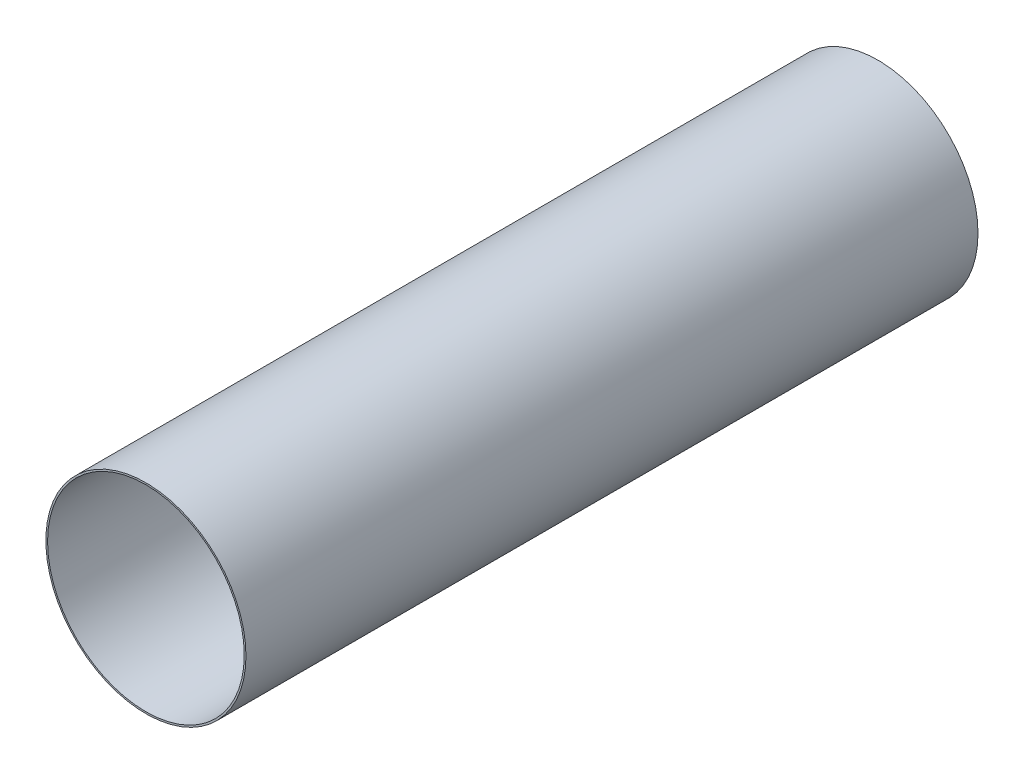
ISO-10303-21;
HEADER;
FILE_DESCRIPTION(('STEP AP214'),'2;1');
FILE_NAME('part.step','',(''),(''),'','','');
FILE_SCHEMA(('AUTOMOTIVE_DESIGN { 1 0 10303 214 1 1 1 1 }'));
ENDSEC;
DATA;
#1=APPLICATION_CONTEXT('core data for automotive mechanical design processes');
#2=APPLICATION_PROTOCOL_DEFINITION('international standard','automotive_design',2000,#1);
#3=PRODUCT_CONTEXT('',#1,'mechanical');
#4=PRODUCT('Part','Part','',(#3));
#5=PRODUCT_RELATED_PRODUCT_CATEGORY('part','',(#4));
#6=PRODUCT_DEFINITION_FORMATION('','',#4);
#7=PRODUCT_DEFINITION_CONTEXT('part definition',#1,'design');
#8=PRODUCT_DEFINITION('design','',#6,#7);
#9=PRODUCT_DEFINITION_SHAPE('','',#8);
#10=(LENGTH_UNIT() NAMED_UNIT(*) SI_UNIT(.MILLI.,.METRE.));
#11=(NAMED_UNIT(*) PLANE_ANGLE_UNIT() SI_UNIT($,.RADIAN.));
#12=(NAMED_UNIT(*) SI_UNIT($,.STERADIAN.) SOLID_ANGLE_UNIT());
#13=UNCERTAINTY_MEASURE_WITH_UNIT(LENGTH_MEASURE(1.E-05),#10,'distance_accuracy_value','');
#14=(GEOMETRIC_REPRESENTATION_CONTEXT(3) GLOBAL_UNCERTAINTY_ASSIGNED_CONTEXT((#13)) GLOBAL_UNIT_ASSIGNED_CONTEXT((#10,
#11,#12)) REPRESENTATION_CONTEXT('',''));
#15=CARTESIAN_POINT('',(0.,0.,0.));
#16=DIRECTION('',(0.,0.,1.));
#17=DIRECTION('',(1.,0.,0.));
#18=AXIS2_PLACEMENT_3D('',#15,#16,#17);
#19=CARTESIAN_POINT('',(0.,0.,-856.));
#20=DIRECTION('',(0.,0.,1.));
#21=DIRECTION('',(1.,0.,0.));
#22=AXIS2_PLACEMENT_3D('',#19,#20,#21);
#23=CYLINDRICAL_SURFACE('',#22,117.);
#24=CARTESIAN_POINT('',(0.,0.,-856.));
#25=DIRECTION('',(0.,0.,1.));
#26=DIRECTION('',(1.,0.,0.));
#27=AXIS2_PLACEMENT_3D('',#24,#25,#26);
#28=CIRCLE('',#27,117.);
#29=CARTESIAN_POINT('',(117.,0.,-856.));
#30=VERTEX_POINT('',#29);
#31=EDGE_CURVE('E10',#30,#30,#28,.T.);
#32=ORIENTED_EDGE('',*,*,#31,.T.);
#33=EDGE_LOOP('',(#32));
#34=FACE_BOUND('',#33,.T.);
#35=CARTESIAN_POINT('',(0.,0.,0.));
#36=DIRECTION('',(0.,0.,1.));
#37=DIRECTION('',(1.,0.,0.));
#38=AXIS2_PLACEMENT_3D('',#35,#36,#37);
#39=CIRCLE('',#38,117.);
#40=CARTESIAN_POINT('',(117.,0.,0.));
#41=VERTEX_POINT('',#40);
#42=EDGE_CURVE('E35',#41,#41,#39,.T.);
#43=ORIENTED_EDGE('',*,*,#42,.F.);
#44=EDGE_LOOP('',(#43));
#45=FACE_BOUND('',#44,.T.);
#46=ADVANCED_FACE('F32',(#34,#45),#23,.T.);
#47=CARTESIAN_POINT('',(0.,0.,-856.));
#48=DIRECTION('',(0.,0.,1.));
#49=DIRECTION('',(1.,0.,0.));
#50=AXIS2_PLACEMENT_3D('',#47,#48,#49);
#51=PLANE('',#50);
#52=CARTESIAN_POINT('',(0.,0.,-856.));
#53=DIRECTION('',(0.,0.,1.));
#54=DIRECTION('',(1.,0.,0.));
#55=AXIS2_PLACEMENT_3D('',#52,#53,#54);
#56=CIRCLE('',#55,115.);
#57=CARTESIAN_POINT('',(115.,0.,-856.));
#58=VERTEX_POINT('',#57);
#59=EDGE_CURVE('E42',#58,#58,#56,.T.);
#60=ORIENTED_EDGE('',*,*,#59,.T.);
#61=EDGE_LOOP('',(#60));
#62=FACE_BOUND('',#61,.T.);
#63=ORIENTED_EDGE('',*,*,#31,.F.);
#64=EDGE_LOOP('',(#63));
#65=FACE_BOUND('',#64,.T.);
#66=ADVANCED_FACE('F50',(#62,#65),#51,.F.);
#67=CARTESIAN_POINT('',(0.,0.,0.));
#68=DIRECTION('',(0.,0.,1.));
#69=DIRECTION('',(1.,0.,0.));
#70=AXIS2_PLACEMENT_3D('',#67,#68,#69);
#71=PLANE('',#70);
#72=CARTESIAN_POINT('',(0.,0.,0.));
#73=DIRECTION('',(0.,0.,1.));
#74=DIRECTION('',(1.,0.,0.));
#75=AXIS2_PLACEMENT_3D('',#72,#73,#74);
#76=CIRCLE('',#75,115.);
#77=CARTESIAN_POINT('',(115.,0.,0.));
#78=VERTEX_POINT('',#77);
#79=EDGE_CURVE('E44',#78,#78,#76,.T.);
#80=ORIENTED_EDGE('',*,*,#79,.F.);
#81=EDGE_LOOP('',(#80));
#82=FACE_BOUND('',#81,.T.);
#83=ORIENTED_EDGE('',*,*,#42,.T.);
#84=EDGE_LOOP('',(#83));
#85=FACE_BOUND('',#84,.T.);
#86=ADVANCED_FACE('F56',(#82,#85),#71,.T.);
#87=CARTESIAN_POINT('',(0.,0.,-856.));
#88=DIRECTION('',(0.,0.,1.));
#89=DIRECTION('',(1.,0.,0.));
#90=AXIS2_PLACEMENT_3D('',#87,#88,#89);
#91=CYLINDRICAL_SURFACE('',#90,115.);
#92=ORIENTED_EDGE('',*,*,#59,.F.);
#93=EDGE_LOOP('',(#92));
#94=FACE_BOUND('',#93,.T.);
#95=ORIENTED_EDGE('',*,*,#79,.T.);
#96=EDGE_LOOP('',(#95));
#97=FACE_BOUND('',#96,.T.);
#98=ADVANCED_FACE('F53',(#94,#97),#91,.F.);
#99=CLOSED_SHELL('',(#46,#66,#86,#98));
#100=MANIFOLD_SOLID_BREP('B2',#99);
#101=ADVANCED_BREP_SHAPE_REPRESENTATION('',(#18,#100),#14);
#102=SHAPE_DEFINITION_REPRESENTATION(#9,#101);
ENDSEC;
END-ISO-10303-21;
